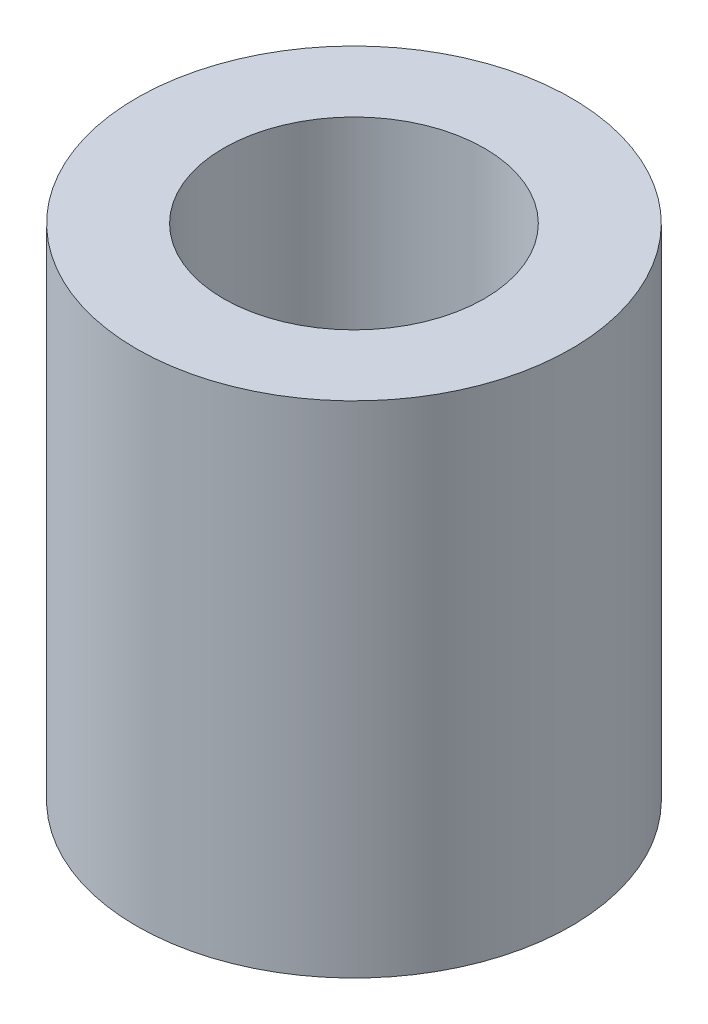
ISO-10303-21;
HEADER;
FILE_DESCRIPTION(('STEP AP214'),'2;1');
FILE_NAME('part.step','',(''),(''),'','','');
FILE_SCHEMA(('AUTOMOTIVE_DESIGN { 1 0 10303 214 1 1 1 1 }'));
ENDSEC;
DATA;
#1=APPLICATION_CONTEXT('core data for automotive mechanical design processes');
#2=APPLICATION_PROTOCOL_DEFINITION('international standard','automotive_design',2000,#1);
#3=PRODUCT_CONTEXT('',#1,'mechanical');
#4=PRODUCT('Part','Part','',(#3));
#5=PRODUCT_RELATED_PRODUCT_CATEGORY('part','',(#4));
#6=PRODUCT_DEFINITION_FORMATION('','',#4);
#7=PRODUCT_DEFINITION_CONTEXT('part definition',#1,'design');
#8=PRODUCT_DEFINITION('design','',#6,#7);
#9=PRODUCT_DEFINITION_SHAPE('','',#8);
#10=(LENGTH_UNIT() NAMED_UNIT(*) SI_UNIT(.MILLI.,.METRE.));
#11=(NAMED_UNIT(*) PLANE_ANGLE_UNIT() SI_UNIT($,.RADIAN.));
#12=(NAMED_UNIT(*) SI_UNIT($,.STERADIAN.) SOLID_ANGLE_UNIT());
#13=UNCERTAINTY_MEASURE_WITH_UNIT(LENGTH_MEASURE(1.E-05),#10,'distance_accuracy_value','');
#14=(GEOMETRIC_REPRESENTATION_CONTEXT(3) GLOBAL_UNCERTAINTY_ASSIGNED_CONTEXT((#13)) GLOBAL_UNIT_ASSIGNED_CONTEXT((#10,
#11,#12)) REPRESENTATION_CONTEXT('',''));
#15=CARTESIAN_POINT('',(0.,0.,0.));
#16=DIRECTION('',(0.,0.,1.));
#17=DIRECTION('',(1.,0.,0.));
#18=AXIS2_PLACEMENT_3D('',#15,#16,#17);
#19=CARTESIAN_POINT('',(0.,11.5,0.));
#20=DIRECTION('',(0.,1.,0.));
#21=DIRECTION('',(0.,0.,1.));
#22=AXIS2_PLACEMENT_3D('',#19,#20,#21);
#23=PLANE('',#22);
#24=CARTESIAN_POINT('',(0.,11.5,0.));
#25=DIRECTION('',(0.,1.,0.));
#26=DIRECTION('',(0.,0.,1.));
#27=AXIS2_PLACEMENT_3D('',#24,#25,#26);
#28=CIRCLE('',#27,5.);
#29=CARTESIAN_POINT('',(0.,11.5,5.));
#30=VERTEX_POINT('',#29);
#31=EDGE_CURVE('E10',#30,#30,#28,.T.);
#32=ORIENTED_EDGE('',*,*,#31,.T.);
#33=EDGE_LOOP('',(#32));
#34=FACE_BOUND('',#33,.T.);
#35=CARTESIAN_POINT('',(0.,11.5,0.));
#36=DIRECTION('',(0.,1.,0.));
#37=DIRECTION('',(0.,0.,1.));
#38=AXIS2_PLACEMENT_3D('',#35,#36,#37);
#39=CIRCLE('',#38,3.);
#40=CARTESIAN_POINT('',(0.,11.5,3.));
#41=VERTEX_POINT('',#40);
#42=EDGE_CURVE('E39',#41,#41,#39,.T.);
#43=ORIENTED_EDGE('',*,*,#42,.F.);
#44=EDGE_LOOP('',(#43));
#45=FACE_BOUND('',#44,.T.);
#46=ADVANCED_FACE('F28',(#34,#45),#23,.T.);
#47=CARTESIAN_POINT('',(0.,0.,0.));
#48=DIRECTION('',(0.,1.,0.));
#49=DIRECTION('',(0.,0.,1.));
#50=AXIS2_PLACEMENT_3D('',#47,#48,#49);
#51=PLANE('',#50);
#52=CARTESIAN_POINT('',(0.,0.,0.));
#53=DIRECTION('',(0.,1.,0.));
#54=DIRECTION('',(0.,0.,1.));
#55=AXIS2_PLACEMENT_3D('',#52,#53,#54);
#56=CIRCLE('',#55,5.);
#57=CARTESIAN_POINT('',(0.,0.,5.));
#58=VERTEX_POINT('',#57);
#59=EDGE_CURVE('E32',#58,#58,#56,.T.);
#60=ORIENTED_EDGE('',*,*,#59,.F.);
#61=EDGE_LOOP('',(#60));
#62=FACE_BOUND('',#61,.T.);
#63=CARTESIAN_POINT('',(0.,0.,0.));
#64=DIRECTION('',(0.,1.,0.));
#65=DIRECTION('',(0.,0.,1.));
#66=AXIS2_PLACEMENT_3D('',#63,#64,#65);
#67=CIRCLE('',#66,3.);
#68=CARTESIAN_POINT('',(0.,0.,3.));
#69=VERTEX_POINT('',#68);
#70=EDGE_CURVE('E41',#69,#69,#67,.T.);
#71=ORIENTED_EDGE('',*,*,#70,.T.);
#72=EDGE_LOOP('',(#71));
#73=FACE_BOUND('',#72,.T.);
#74=ADVANCED_FACE('F51',(#62,#73),#51,.F.);
#75=CARTESIAN_POINT('',(0.,11.5,0.));
#76=DIRECTION('',(0.,-1.,0.));
#77=DIRECTION('',(0.,0.,-1.));
#78=AXIS2_PLACEMENT_3D('',#75,#76,#77);
#79=CYLINDRICAL_SURFACE('',#78,5.);
#80=ORIENTED_EDGE('',*,*,#31,.F.);
#81=EDGE_LOOP('',(#80));
#82=FACE_BOUND('',#81,.T.);
#83=ORIENTED_EDGE('',*,*,#59,.T.);
#84=EDGE_LOOP('',(#83));
#85=FACE_BOUND('',#84,.T.);
#86=ADVANCED_FACE('F30',(#82,#85),#79,.T.);
#87=CARTESIAN_POINT('',(0.,11.5,0.));
#88=DIRECTION('',(0.,-1.,0.));
#89=DIRECTION('',(0.,0.,-1.));
#90=AXIS2_PLACEMENT_3D('',#87,#88,#89);
#91=CYLINDRICAL_SURFACE('',#90,3.);
#92=ORIENTED_EDGE('',*,*,#42,.T.);
#93=EDGE_LOOP('',(#92));
#94=FACE_BOUND('',#93,.T.);
#95=ORIENTED_EDGE('',*,*,#70,.F.);
#96=EDGE_LOOP('',(#95));
#97=FACE_BOUND('',#96,.T.);
#98=ADVANCED_FACE('F47',(#94,#97),#91,.F.);
#99=CLOSED_SHELL('',(#46,#74,#86,#98));
#100=MANIFOLD_SOLID_BREP('B2',#99);
#101=ADVANCED_BREP_SHAPE_REPRESENTATION('',(#18,#100),#14);
#102=SHAPE_DEFINITION_REPRESENTATION(#9,#101);
ENDSEC;
END-ISO-10303-21;
